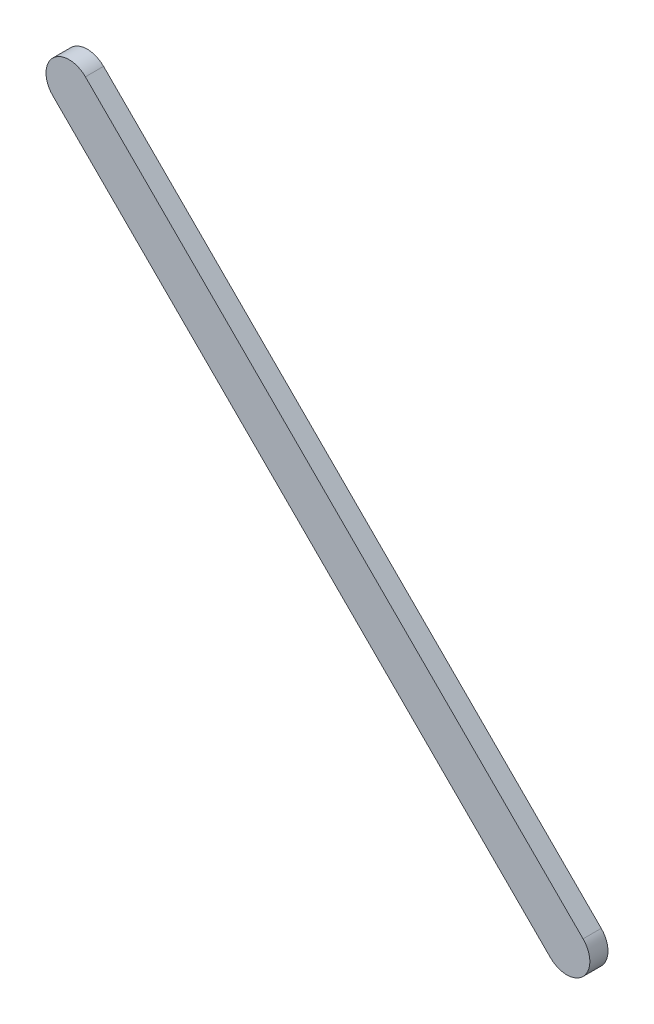
ISO-10303-21;
HEADER;
FILE_DESCRIPTION(('STEP AP214'),'2;1');
FILE_NAME('part.step','',(''),(''),'','','');
FILE_SCHEMA(('AUTOMOTIVE_DESIGN { 1 0 10303 214 1 1 1 1 }'));
ENDSEC;
DATA;
#1=APPLICATION_CONTEXT('core data for automotive mechanical design processes');
#2=APPLICATION_PROTOCOL_DEFINITION('international standard','automotive_design',2000,#1);
#3=PRODUCT_CONTEXT('',#1,'mechanical');
#4=PRODUCT('Part','Part','',(#3));
#5=PRODUCT_RELATED_PRODUCT_CATEGORY('part','',(#4));
#6=PRODUCT_DEFINITION_FORMATION('','',#4);
#7=PRODUCT_DEFINITION_CONTEXT('part definition',#1,'design');
#8=PRODUCT_DEFINITION('design','',#6,#7);
#9=PRODUCT_DEFINITION_SHAPE('','',#8);
#10=(LENGTH_UNIT() NAMED_UNIT(*) SI_UNIT(.MILLI.,.METRE.));
#11=(NAMED_UNIT(*) PLANE_ANGLE_UNIT() SI_UNIT($,.RADIAN.));
#12=(NAMED_UNIT(*) SI_UNIT($,.STERADIAN.) SOLID_ANGLE_UNIT());
#13=UNCERTAINTY_MEASURE_WITH_UNIT(LENGTH_MEASURE(1.E-05),#10,'distance_accuracy_value','');
#14=(GEOMETRIC_REPRESENTATION_CONTEXT(3) GLOBAL_UNCERTAINTY_ASSIGNED_CONTEXT((#13)) GLOBAL_UNIT_ASSIGNED_CONTEXT((#10,
#11,#12)) REPRESENTATION_CONTEXT('',''));
#15=CARTESIAN_POINT('',(0.,0.,0.));
#16=DIRECTION('',(0.,0.,1.));
#17=DIRECTION('',(1.,0.,0.));
#18=AXIS2_PLACEMENT_3D('',#15,#16,#17);
#19=CARTESIAN_POINT('',(131.22099486,63.7203958,0.));
#20=DIRECTION('',(0.707106781186547,0.707106781186548,0.));
#21=DIRECTION('',(0.707106781186548,-0.707106781186547,0.));
#22=AXIS2_PLACEMENT_3D('',#19,#20,#21);
#23=PLANE('',#22);
#24=DIRECTION('',(0.707106781186548,-0.707106781186547,0.));
#25=VECTOR('',#24,1.);
#26=CARTESIAN_POINT('',(131.22099486,63.7203958,0.1999996));
#27=LINE('',#26,#25);
#28=CARTESIAN_POINT('',(131.22099486,63.7203958,0.1999996));
#29=VERTEX_POINT('',#28);
#30=CARTESIAN_POINT('',(136.7009966,58.24039406,0.1999996));
#31=VERTEX_POINT('',#30);
#32=EDGE_CURVE('E11',#29,#31,#27,.T.);
#33=ORIENTED_EDGE('',*,*,#32,.F.);
#34=DIRECTION('',(0.,0.,1.));
#35=VECTOR('',#34,1.);
#36=CARTESIAN_POINT('',(131.22099486,63.7203958,0.));
#37=LINE('',#36,#35);
#38=CARTESIAN_POINT('',(131.22099486,63.7203958,0.));
#39=VERTEX_POINT('',#38);
#40=EDGE_CURVE('E24',#39,#29,#37,.T.);
#41=ORIENTED_EDGE('',*,*,#40,.F.);
#42=DIRECTION('',(0.707106781186548,-0.707106781186547,0.));
#43=VECTOR('',#42,1.);
#44=CARTESIAN_POINT('',(131.22099486,63.7203958,0.));
#45=LINE('',#44,#43);
#46=CARTESIAN_POINT('',(136.7009966,58.24039406,0.));
#47=VERTEX_POINT('',#46);
#48=EDGE_CURVE('E75',#39,#47,#45,.T.);
#49=ORIENTED_EDGE('',*,*,#48,.T.);
#50=DIRECTION('',(0.,0.,1.));
#51=VECTOR('',#50,1.);
#52=CARTESIAN_POINT('',(136.7009966,58.24039406,0.));
#53=LINE('',#52,#51);
#54=EDGE_CURVE('E37',#47,#31,#53,.T.);
#55=ORIENTED_EDGE('',*,*,#54,.T.);
#56=EDGE_LOOP('',(#33,#41,#49,#55));
#57=FACE_BOUND('',#56,.T.);
#58=ADVANCED_FACE('F17',(#57),#23,.F.);
#59=CARTESIAN_POINT('',(136.88060127,58.41999873,0.));
#60=DIRECTION('',(0.,0.,-1.));
#61=DIRECTION('',(-0.707106781186548,-0.707106781186548,0.));
#62=AXIS2_PLACEMENT_3D('',#59,#60,#61);
#63=CYLINDRICAL_SURFACE('',#62,0.253999360179547);
#64=CARTESIAN_POINT('',(136.88060127,58.41999873,0.1999996));
#65=DIRECTION('',(0.,0.,1.));
#66=DIRECTION('',(-0.707106781186548,-0.707106781186548,0.));
#67=AXIS2_PLACEMENT_3D('',#64,#65,#66);
#68=CIRCLE('',#67,0.253999360179547);
#69=CARTESIAN_POINT('',(137.06020594,58.5996034,0.1999996));
#70=VERTEX_POINT('',#69);
#71=EDGE_CURVE('E83',#31,#70,#68,.T.);
#72=ORIENTED_EDGE('',*,*,#71,.F.);
#73=ORIENTED_EDGE('',*,*,#54,.F.);
#74=CARTESIAN_POINT('',(136.88060127,58.41999873,0.));
#75=DIRECTION('',(0.,0.,1.));
#76=DIRECTION('',(-0.707106781186548,-0.707106781186548,0.));
#77=AXIS2_PLACEMENT_3D('',#74,#75,#76);
#78=CIRCLE('',#77,0.253999360179547);
#79=CARTESIAN_POINT('',(137.06020594,58.5996034,0.));
#80=VERTEX_POINT('',#79);
#81=EDGE_CURVE('E81',#47,#80,#78,.T.);
#82=ORIENTED_EDGE('',*,*,#81,.T.);
#83=DIRECTION('',(0.,0.,1.));
#84=VECTOR('',#83,1.);
#85=CARTESIAN_POINT('',(137.06020594,58.5996034,0.));
#86=LINE('',#85,#84);
#87=EDGE_CURVE('E67',#80,#70,#86,.T.);
#88=ORIENTED_EDGE('',*,*,#87,.T.);
#89=EDGE_LOOP('',(#72,#73,#82,#88));
#90=FACE_BOUND('',#89,.T.);
#91=ADVANCED_FACE('F89',(#90),#63,.T.);
#92=CARTESIAN_POINT('',(137.06020594,58.5996034,0.));
#93=DIRECTION('',(-0.707106781186547,-0.707106781186548,0.));
#94=DIRECTION('',(-0.707106781186548,0.707106781186547,0.));
#95=AXIS2_PLACEMENT_3D('',#92,#93,#94);
#96=PLANE('',#95);
#97=DIRECTION('',(-0.707106781186548,0.707106781186547,0.));
#98=VECTOR('',#97,1.);
#99=CARTESIAN_POINT('',(137.06020594,58.5996034,0.1999996));
#100=LINE('',#99,#98);
#101=CARTESIAN_POINT('',(131.5802042,64.07960514,0.1999996));
#102=VERTEX_POINT('',#101);
#103=EDGE_CURVE('E71',#70,#102,#100,.T.);
#104=ORIENTED_EDGE('',*,*,#103,.F.);
#105=ORIENTED_EDGE('',*,*,#87,.F.);
#106=DIRECTION('',(-0.707106781186548,0.707106781186547,0.));
#107=VECTOR('',#106,1.);
#108=CARTESIAN_POINT('',(137.06020594,58.5996034,0.));
#109=LINE('',#108,#107);
#110=CARTESIAN_POINT('',(131.5802042,64.07960514,0.));
#111=VERTEX_POINT('',#110);
#112=EDGE_CURVE('E63',#80,#111,#109,.T.);
#113=ORIENTED_EDGE('',*,*,#112,.T.);
#114=DIRECTION('',(0.,0.,1.));
#115=VECTOR('',#114,1.);
#116=CARTESIAN_POINT('',(131.5802042,64.07960514,0.));
#117=LINE('',#116,#115);
#118=EDGE_CURVE('E53',#111,#102,#117,.T.);
#119=ORIENTED_EDGE('',*,*,#118,.T.);
#120=EDGE_LOOP('',(#104,#105,#113,#119));
#121=FACE_BOUND('',#120,.T.);
#122=ADVANCED_FACE('F66',(#121),#96,.F.);
#123=CARTESIAN_POINT('',(131.40059953,63.90000047,0.));
#124=DIRECTION('',(0.,0.,-1.));
#125=DIRECTION('',(0.707106781186548,0.707106781186548,0.));
#126=AXIS2_PLACEMENT_3D('',#123,#124,#125);
#127=CYLINDRICAL_SURFACE('',#126,0.253999360179547);
#128=CARTESIAN_POINT('',(131.40059953,63.90000047,0.1999996));
#129=DIRECTION('',(0.,0.,1.));
#130=DIRECTION('',(0.707106781186548,0.707106781186548,0.));
#131=AXIS2_PLACEMENT_3D('',#128,#129,#130);
#132=CIRCLE('',#131,0.253999360179547);
#133=EDGE_CURVE('E59',#102,#29,#132,.T.);
#134=ORIENTED_EDGE('',*,*,#133,.F.);
#135=ORIENTED_EDGE('',*,*,#118,.F.);
#136=CARTESIAN_POINT('',(131.40059953,63.90000047,0.));
#137=DIRECTION('',(0.,0.,1.));
#138=DIRECTION('',(0.707106781186548,0.707106781186548,0.));
#139=AXIS2_PLACEMENT_3D('',#136,#137,#138);
#140=CIRCLE('',#139,0.253999360179547);
#141=EDGE_CURVE('E57',#111,#39,#140,.T.);
#142=ORIENTED_EDGE('',*,*,#141,.T.);
#143=ORIENTED_EDGE('',*,*,#40,.T.);
#144=EDGE_LOOP('',(#134,#135,#142,#143));
#145=FACE_BOUND('',#144,.T.);
#146=ADVANCED_FACE('F55',(#145),#127,.T.);
#147=CARTESIAN_POINT('',(131.22099486,63.7203958,0.));
#148=DIRECTION('',(0.,0.,-1.));
#149=DIRECTION('',(-1.,0.,0.));
#150=AXIS2_PLACEMENT_3D('',#147,#148,#149);
#151=PLANE('',#150);
#152=ORIENTED_EDGE('',*,*,#141,.F.);
#153=ORIENTED_EDGE('',*,*,#112,.F.);
#154=ORIENTED_EDGE('',*,*,#81,.F.);
#155=ORIENTED_EDGE('',*,*,#48,.F.);
#156=EDGE_LOOP('',(#152,#153,#154,#155));
#157=FACE_BOUND('',#156,.T.);
#158=ADVANCED_FACE('F74',(#157),#151,.T.);
#159=CARTESIAN_POINT('',(131.22099486,63.7203958,0.1999996));
#160=DIRECTION('',(0.,0.,-1.));
#161=DIRECTION('',(-1.,0.,0.));
#162=AXIS2_PLACEMENT_3D('',#159,#160,#161);
#163=PLANE('',#162);
#164=ORIENTED_EDGE('',*,*,#32,.T.);
#165=ORIENTED_EDGE('',*,*,#71,.T.);
#166=ORIENTED_EDGE('',*,*,#103,.T.);
#167=ORIENTED_EDGE('',*,*,#133,.T.);
#168=EDGE_LOOP('',(#164,#165,#166,#167));
#169=FACE_BOUND('',#168,.T.);
#170=ADVANCED_FACE('F91',(#169),#163,.F.);
#171=CLOSED_SHELL('',(#58,#91,#122,#146,#158,#170));
#172=MANIFOLD_SOLID_BREP('B1',#171);
#173=ADVANCED_BREP_SHAPE_REPRESENTATION('',(#18,#172),#14);
#174=SHAPE_DEFINITION_REPRESENTATION(#9,#173);
ENDSEC;
END-ISO-10303-21;
